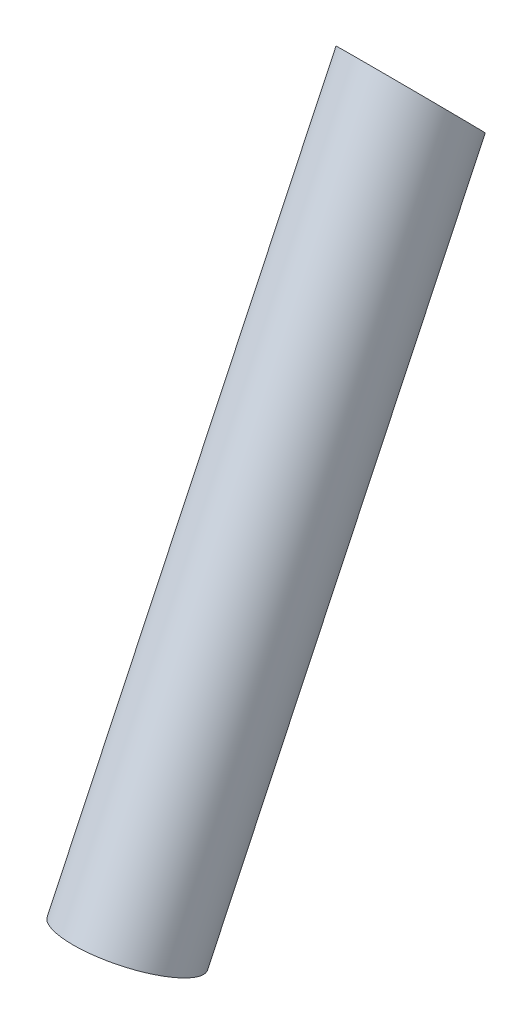
ISO-10303-21;
HEADER;
FILE_DESCRIPTION(('STEP AP214'),'2;1');
FILE_NAME('part.step','',(''),(''),'','','');
FILE_SCHEMA(('AUTOMOTIVE_DESIGN { 1 0 10303 214 1 1 1 1 }'));
ENDSEC;
DATA;
#1=APPLICATION_CONTEXT('core data for automotive mechanical design processes');
#2=APPLICATION_PROTOCOL_DEFINITION('international standard','automotive_design',2000,#1);
#3=PRODUCT_CONTEXT('',#1,'mechanical');
#4=PRODUCT('Part','Part','',(#3));
#5=PRODUCT_RELATED_PRODUCT_CATEGORY('part','',(#4));
#6=PRODUCT_DEFINITION_FORMATION('','',#4);
#7=PRODUCT_DEFINITION_CONTEXT('part definition',#1,'design');
#8=PRODUCT_DEFINITION('design','',#6,#7);
#9=PRODUCT_DEFINITION_SHAPE('','',#8);
#10=(LENGTH_UNIT() NAMED_UNIT(*) SI_UNIT(.MILLI.,.METRE.));
#11=(NAMED_UNIT(*) PLANE_ANGLE_UNIT() SI_UNIT($,.RADIAN.));
#12=(NAMED_UNIT(*) SI_UNIT($,.STERADIAN.) SOLID_ANGLE_UNIT());
#13=UNCERTAINTY_MEASURE_WITH_UNIT(LENGTH_MEASURE(1.E-05),#10,'distance_accuracy_value','');
#14=(GEOMETRIC_REPRESENTATION_CONTEXT(3) GLOBAL_UNCERTAINTY_ASSIGNED_CONTEXT((#13)) GLOBAL_UNIT_ASSIGNED_CONTEXT((#10,
#11,#12)) REPRESENTATION_CONTEXT('',''));
#15=CARTESIAN_POINT('',(0.,0.,0.));
#16=DIRECTION('',(0.,0.,1.));
#17=DIRECTION('',(1.,0.,0.));
#18=AXIS2_PLACEMENT_3D('',#15,#16,#17);
#19=CARTESIAN_POINT('',(0.,39.9999999999998,1550.));
#20=DIRECTION('',(0.,0.903686773002132,-0.42819413389372));
#21=DIRECTION('',(0.,0.42819413389372,0.903686773002132));
#22=AXIS2_PLACEMENT_3D('',#19,#20,#21);
#23=CYLINDRICAL_SURFACE('',#22,9.);
#24=CARTESIAN_POINT('',(0.,39.9999999999998,1550.));
#25=DIRECTION('',(0.,-0.903686773002132,0.42819413389372));
#26=DIRECTION('',(0.,-0.42819413389372,-0.903686773002132));
#27=AXIS2_PLACEMENT_3D('',#24,#25,#26);
#28=CIRCLE('',#27,9.);
#29=CARTESIAN_POINT('',(0.,36.1462527949563,1541.86681904298));
#30=VERTEX_POINT('',#29);
#31=EDGE_CURVE('E53',#30,#30,#28,.T.);
#32=ORIENTED_EDGE('',*,*,#31,.T.);
#33=EDGE_LOOP('',(#32));
#34=FACE_BOUND('',#33,.T.);
#35=CARTESIAN_POINT('',(0.,140.,1502.61697452191));
#36=DIRECTION('',(0.,0.702736773046393,-0.711449947507443));
#37=DIRECTION('',(0.,0.711449947507443,0.702736773046393));
#38=AXIS2_PLACEMENT_3D('',#35,#36,#37);
#39=ELLIPSE('',#38,9.57759995228321,9.);
#40=CARTESIAN_POINT('',(0.,146.813982983299,1509.34750620591));
#41=VERTEX_POINT('',#40);
#42=EDGE_CURVE('E43',#41,#41,#39,.T.);
#43=ORIENTED_EDGE('',*,*,#42,.T.);
#44=EDGE_LOOP('',(#43));
#45=FACE_BOUND('',#44,.T.);
#46=ADVANCED_FACE('F39',(#34,#45),#23,.F.);
#47=CARTESIAN_POINT('',(0.,39.9999999999998,1550.));
#48=DIRECTION('',(0.,0.903686773002132,-0.42819413389372));
#49=DIRECTION('',(0.,0.42819413389372,0.903686773002132));
#50=AXIS2_PLACEMENT_3D('',#47,#48,#49);
#51=CYLINDRICAL_SURFACE('',#50,10.);
#52=CARTESIAN_POINT('',(0.,39.9999999999998,1550.));
#53=DIRECTION('',(0.,-0.903686773002132,0.42819413389372));
#54=DIRECTION('',(0.,-0.42819413389372,-0.903686773002132));
#55=AXIS2_PLACEMENT_3D('',#52,#53,#54);
#56=CIRCLE('',#55,10.);
#57=CARTESIAN_POINT('',(0.,35.7180586610626,1540.96313226998));
#58=VERTEX_POINT('',#57);
#59=EDGE_CURVE('E47',#58,#58,#56,.T.);
#60=ORIENTED_EDGE('',*,*,#59,.F.);
#61=EDGE_LOOP('',(#60));
#62=FACE_BOUND('',#61,.T.);
#63=CARTESIAN_POINT('',(0.,140.,1502.61697452191));
#64=DIRECTION('',(0.,0.702736773046393,-0.711449947507443));
#65=DIRECTION('',(0.,0.711449947507443,0.702736773046393));
#66=AXIS2_PLACEMENT_3D('',#63,#64,#65);
#67=ELLIPSE('',#66,10.6417777247592,10.);
#68=CARTESIAN_POINT('',(0.,147.571092203666,1510.09534305969));
#69=VERTEX_POINT('',#68);
#70=EDGE_CURVE('E10',#69,#69,#67,.T.);
#71=ORIENTED_EDGE('',*,*,#70,.F.);
#72=EDGE_LOOP('',(#71));
#73=FACE_BOUND('',#72,.T.);
#74=ADVANCED_FACE('F67',(#62,#73),#51,.T.);
#75=CARTESIAN_POINT('',(0.,39.9999999999998,1550.));
#76=DIRECTION('',(0.,-0.903686773002132,0.42819413389372));
#77=DIRECTION('',(0.,-0.42819413389372,-0.903686773002132));
#78=AXIS2_PLACEMENT_3D('',#75,#76,#77);
#79=PLANE('',#78);
#80=ORIENTED_EDGE('',*,*,#31,.F.);
#81=EDGE_LOOP('',(#80));
#82=FACE_BOUND('',#81,.T.);
#83=ORIENTED_EDGE('',*,*,#59,.T.);
#84=EDGE_LOOP('',(#83));
#85=FACE_BOUND('',#84,.T.);
#86=ADVANCED_FACE('F62',(#82,#85),#79,.T.);
#87=CARTESIAN_POINT('',(0.,140.,1502.61697452191));
#88=DIRECTION('',(0.,0.702736773046393,-0.711449947507443));
#89=DIRECTION('',(0.,0.711449947507443,0.702736773046393));
#90=AXIS2_PLACEMENT_3D('',#87,#88,#89);
#91=PLANE('',#90);
#92=ORIENTED_EDGE('',*,*,#42,.F.);
#93=EDGE_LOOP('',(#92));
#94=FACE_BOUND('',#93,.T.);
#95=ORIENTED_EDGE('',*,*,#70,.T.);
#96=EDGE_LOOP('',(#95));
#97=FACE_BOUND('',#96,.T.);
#98=ADVANCED_FACE('F41',(#94,#97),#91,.T.);
#99=CLOSED_SHELL('',(#46,#74,#86,#98));
#100=MANIFOLD_SOLID_BREP('B2',#99);
#101=ADVANCED_BREP_SHAPE_REPRESENTATION('',(#18,#100),#14);
#102=SHAPE_DEFINITION_REPRESENTATION(#9,#101);
ENDSEC;
END-ISO-10303-21;
